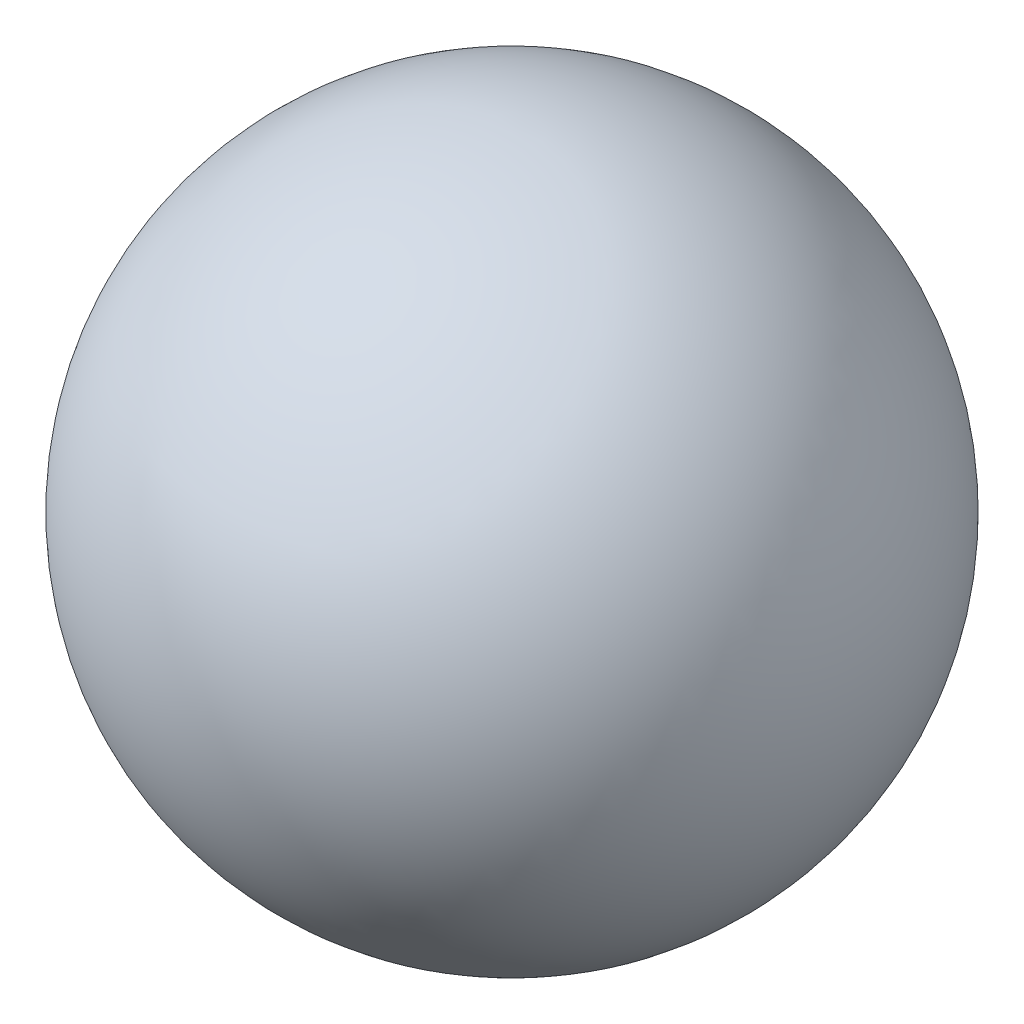
ISO-10303-21;
HEADER;
FILE_DESCRIPTION(('STEP AP214'),'2;1');
FILE_NAME('part.step','',(''),(''),'','','');
FILE_SCHEMA(('AUTOMOTIVE_DESIGN { 1 0 10303 214 1 1 1 1 }'));
ENDSEC;
DATA;
#1=APPLICATION_CONTEXT('core data for automotive mechanical design processes');
#2=APPLICATION_PROTOCOL_DEFINITION('international standard','automotive_design',2000,#1);
#3=PRODUCT_CONTEXT('',#1,'mechanical');
#4=PRODUCT('Part','Part','',(#3));
#5=PRODUCT_RELATED_PRODUCT_CATEGORY('part','',(#4));
#6=PRODUCT_DEFINITION_FORMATION('','',#4);
#7=PRODUCT_DEFINITION_CONTEXT('part definition',#1,'design');
#8=PRODUCT_DEFINITION('design','',#6,#7);
#9=PRODUCT_DEFINITION_SHAPE('','',#8);
#10=(LENGTH_UNIT() NAMED_UNIT(*) SI_UNIT(.MILLI.,.METRE.));
#11=(NAMED_UNIT(*) PLANE_ANGLE_UNIT() SI_UNIT($,.RADIAN.));
#12=(NAMED_UNIT(*) SI_UNIT($,.STERADIAN.) SOLID_ANGLE_UNIT());
#13=UNCERTAINTY_MEASURE_WITH_UNIT(LENGTH_MEASURE(1.E-05),#10,'distance_accuracy_value','');
#14=(GEOMETRIC_REPRESENTATION_CONTEXT(3) GLOBAL_UNCERTAINTY_ASSIGNED_CONTEXT((#13)) GLOBAL_UNIT_ASSIGNED_CONTEXT((#10,
#11,#12)) REPRESENTATION_CONTEXT('',''));
#15=CARTESIAN_POINT('',(0.,0.,0.));
#16=DIRECTION('',(0.,0.,1.));
#17=DIRECTION('',(1.,0.,0.));
#18=AXIS2_PLACEMENT_3D('',#15,#16,#17);
#19=CARTESIAN_POINT('',(0.,0.,0.));
#20=DIRECTION('',(0.,-1.,0.));
#21=DIRECTION('',(-1.,0.,0.));
#22=AXIS2_PLACEMENT_3D('',#19,#20,#21);
#23=SPHERICAL_SURFACE('',#22,18.);
#24=CARTESIAN_POINT('',(0.,-18.,0.));
#25=VERTEX_POINT('',#24);
#26=VERTEX_LOOP('',#25);
#27=FACE_BOUND('',#26,.T.);
#28=ADVANCED_FACE('F33',(#27),#23,.T.);
#29=CLOSED_SHELL('',(#28));
#30=MANIFOLD_SOLID_BREP('B2',#29);
#31=ADVANCED_BREP_SHAPE_REPRESENTATION('',(#18,#30),#14);
#32=SHAPE_DEFINITION_REPRESENTATION(#9,#31);
ENDSEC;
END-ISO-10303-21;
